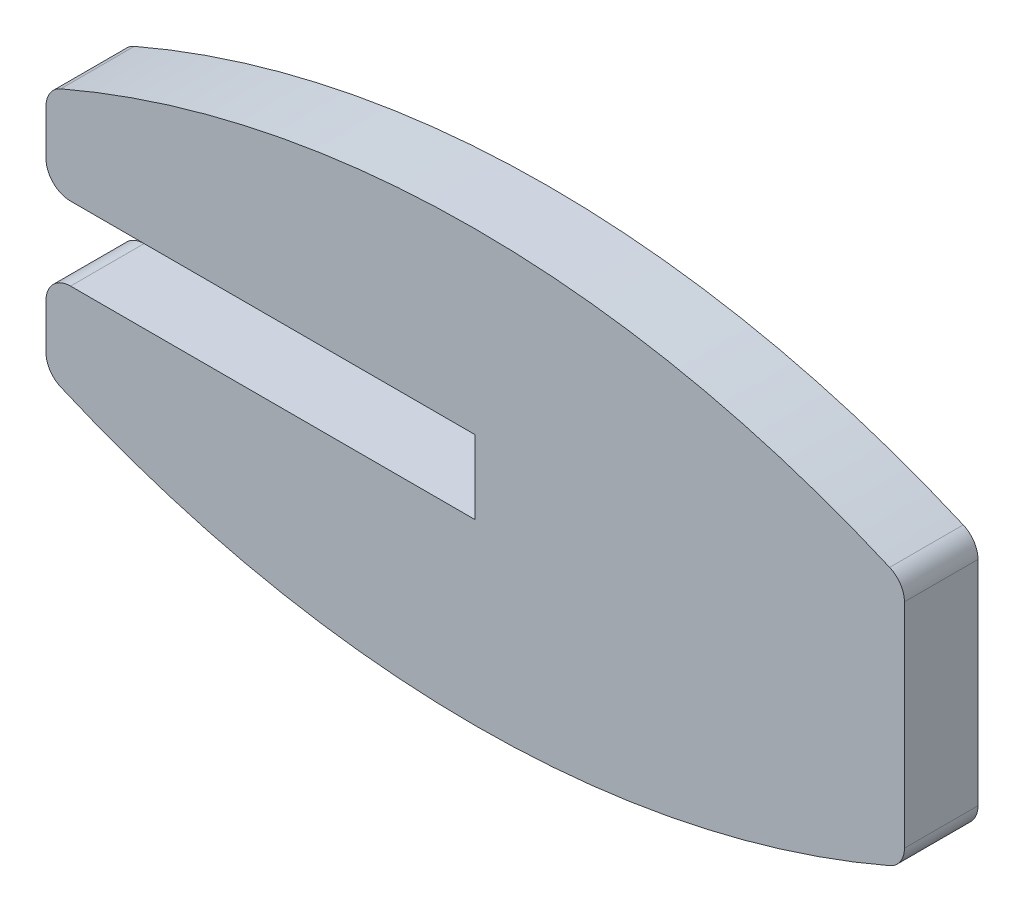
ISO-10303-21;
HEADER;
FILE_DESCRIPTION(('STEP AP214'),'2;1');
FILE_NAME('part.step','',(''),(''),'','','');
FILE_SCHEMA(('AUTOMOTIVE_DESIGN { 1 0 10303 214 1 1 1 1 }'));
ENDSEC;
DATA;
#1=APPLICATION_CONTEXT('core data for automotive mechanical design processes');
#2=APPLICATION_PROTOCOL_DEFINITION('international standard','automotive_design',2000,#1);
#3=PRODUCT_CONTEXT('',#1,'mechanical');
#4=PRODUCT('Part','Part','',(#3));
#5=PRODUCT_RELATED_PRODUCT_CATEGORY('part','',(#4));
#6=PRODUCT_DEFINITION_FORMATION('','',#4);
#7=PRODUCT_DEFINITION_CONTEXT('part definition',#1,'design');
#8=PRODUCT_DEFINITION('design','',#6,#7);
#9=PRODUCT_DEFINITION_SHAPE('','',#8);
#10=(LENGTH_UNIT() NAMED_UNIT(*) SI_UNIT(.MILLI.,.METRE.));
#11=(NAMED_UNIT(*) PLANE_ANGLE_UNIT() SI_UNIT($,.RADIAN.));
#12=(NAMED_UNIT(*) SI_UNIT($,.STERADIAN.) SOLID_ANGLE_UNIT());
#13=UNCERTAINTY_MEASURE_WITH_UNIT(LENGTH_MEASURE(1.E-05),#10,'distance_accuracy_value','');
#14=(GEOMETRIC_REPRESENTATION_CONTEXT(3) GLOBAL_UNCERTAINTY_ASSIGNED_CONTEXT((#13)) GLOBAL_UNIT_ASSIGNED_CONTEXT((#10,
#11,#12)) REPRESENTATION_CONTEXT('',''));
#15=CARTESIAN_POINT('',(0.,0.,0.));
#16=DIRECTION('',(0.,0.,1.));
#17=DIRECTION('',(1.,0.,0.));
#18=AXIS2_PLACEMENT_3D('',#15,#16,#17);
#19=CARTESIAN_POINT('',(0.,0.,3.));
#20=DIRECTION('',(1.,0.,0.));
#21=DIRECTION('',(0.,1.,0.));
#22=AXIS2_PLACEMENT_3D('',#19,#20,#21);
#23=PLANE('',#22);
#24=DIRECTION('',(0.,-1.,0.));
#25=VECTOR('',#24,1.);
#26=CARTESIAN_POINT('',(0.,0.,0.));
#27=LINE('',#26,#25);
#28=CARTESIAN_POINT('',(0.,1.5,0.));
#29=VERTEX_POINT('',#28);
#30=CARTESIAN_POINT('',(0.,-1.5,0.));
#31=VERTEX_POINT('',#30);
#32=EDGE_CURVE('E160',#29,#31,#27,.T.);
#33=ORIENTED_EDGE('',*,*,#32,.T.);
#34=DIRECTION('',(0.,0.,-1.));
#35=VECTOR('',#34,1.);
#36=CARTESIAN_POINT('',(0.,-1.5,3.));
#37=LINE('',#36,#35);
#38=CARTESIAN_POINT('',(0.,-1.5,3.));
#39=VERTEX_POINT('',#38);
#40=EDGE_CURVE('E145',#39,#31,#37,.T.);
#41=ORIENTED_EDGE('',*,*,#40,.F.);
#42=DIRECTION('',(0.,-1.,0.));
#43=VECTOR('',#42,1.);
#44=CARTESIAN_POINT('',(0.,0.,3.));
#45=LINE('',#44,#43);
#46=CARTESIAN_POINT('',(0.,1.5,3.));
#47=VERTEX_POINT('',#46);
#48=EDGE_CURVE('E150',#47,#39,#45,.T.);
#49=ORIENTED_EDGE('',*,*,#48,.F.);
#50=DIRECTION('',(0.,0.,-1.));
#51=VECTOR('',#50,1.);
#52=CARTESIAN_POINT('',(0.,1.5,3.));
#53=LINE('',#52,#51);
#54=EDGE_CURVE('E162',#47,#29,#53,.T.);
#55=ORIENTED_EDGE('',*,*,#54,.T.);
#56=EDGE_LOOP('',(#33,#41,#49,#55));
#57=FACE_BOUND('',#56,.T.);
#58=ADVANCED_FACE('F37',(#57),#23,.F.);
#59=CARTESIAN_POINT('',(0.,-1.5,3.));
#60=DIRECTION('',(0.,-1.,0.));
#61=DIRECTION('',(1.,0.,0.));
#62=AXIS2_PLACEMENT_3D('',#59,#60,#61);
#63=PLANE('',#62);
#64=DIRECTION('',(-1.,0.,0.));
#65=VECTOR('',#64,1.);
#66=CARTESIAN_POINT('',(0.,-1.5,0.));
#67=LINE('',#66,#65);
#68=CARTESIAN_POINT('',(-16.5,-1.5,0.));
#69=VERTEX_POINT('',#68);
#70=EDGE_CURVE('E243',#31,#69,#67,.T.);
#71=ORIENTED_EDGE('',*,*,#70,.T.);
#72=DIRECTION('',(0.,0.,-1.));
#73=VECTOR('',#72,1.);
#74=CARTESIAN_POINT('',(-16.5,-1.5,3.));
#75=LINE('',#74,#73);
#76=CARTESIAN_POINT('',(-16.5,-1.5,3.));
#77=VERTEX_POINT('',#76);
#78=EDGE_CURVE('E45',#69,#77,#75,.F.);
#79=ORIENTED_EDGE('',*,*,#78,.T.);
#80=DIRECTION('',(-1.,0.,0.));
#81=VECTOR('',#80,1.);
#82=CARTESIAN_POINT('',(0.,-1.5,3.));
#83=LINE('',#82,#81);
#84=EDGE_CURVE('E140',#39,#77,#83,.T.);
#85=ORIENTED_EDGE('',*,*,#84,.F.);
#86=ORIENTED_EDGE('',*,*,#40,.T.);
#87=EDGE_LOOP('',(#71,#79,#85,#86));
#88=FACE_BOUND('',#87,.T.);
#89=ADVANCED_FACE('F143',(#88),#63,.F.);
#90=CARTESIAN_POINT('',(-17.5,0.,3.));
#91=DIRECTION('',(-1.,0.,0.));
#92=DIRECTION('',(0.,0.,1.));
#93=AXIS2_PLACEMENT_3D('',#90,#91,#92);
#94=PLANE('',#93);
#95=DIRECTION('',(0.,1.,0.));
#96=VECTOR('',#95,1.);
#97=CARTESIAN_POINT('',(-17.5,0.,0.));
#98=LINE('',#97,#96);
#99=CARTESIAN_POINT('',(-17.5,-4.34903206724537,0.));
#100=VERTEX_POINT('',#99);
#101=CARTESIAN_POINT('',(-17.5,-2.5,0.));
#102=VERTEX_POINT('',#101);
#103=EDGE_CURVE('E220',#100,#102,#98,.T.);
#104=ORIENTED_EDGE('',*,*,#103,.F.);
#105=DIRECTION('',(0.,0.,1.));
#106=VECTOR('',#105,1.);
#107=CARTESIAN_POINT('',(-17.5,-4.34903206724537,3.));
#108=LINE('',#107,#106);
#109=CARTESIAN_POINT('',(-17.5,-4.34903206724537,3.));
#110=VERTEX_POINT('',#109);
#111=EDGE_CURVE('E211',#100,#110,#108,.T.);
#112=ORIENTED_EDGE('',*,*,#111,.T.);
#113=DIRECTION('',(0.,1.,0.));
#114=VECTOR('',#113,1.);
#115=CARTESIAN_POINT('',(-17.5,0.,3.));
#116=LINE('',#115,#114);
#117=CARTESIAN_POINT('',(-17.5,-2.5,3.));
#118=VERTEX_POINT('',#117);
#119=EDGE_CURVE('E149',#110,#118,#116,.T.);
#120=ORIENTED_EDGE('',*,*,#119,.T.);
#121=DIRECTION('',(0.,0.,-1.));
#122=VECTOR('',#121,1.);
#123=CARTESIAN_POINT('',(-17.5,-2.5,0.));
#124=LINE('',#123,#122);
#125=EDGE_CURVE('E208',#118,#102,#124,.T.);
#126=ORIENTED_EDGE('',*,*,#125,.T.);
#127=EDGE_LOOP('',(#104,#112,#120,#126));
#128=FACE_BOUND('',#127,.T.);
#129=ADVANCED_FACE('F217',(#128),#94,.T.);
#130=CARTESIAN_POINT('',(0.,33.7298334620742,3.));
#131=DIRECTION('',(0.,0.,-1.));
#132=DIRECTION('',(-1.,0.,0.));
#133=AXIS2_PLACEMENT_3D('',#130,#131,#132);
#134=CYLINDRICAL_SURFACE('',#133,42.5);
#135=CARTESIAN_POINT('',(0.,33.7298334620742,0.));
#136=DIRECTION('',(0.,0.,1.));
#137=DIRECTION('',(1.,0.,0.));
#138=AXIS2_PLACEMENT_3D('',#135,#136,#137);
#139=CIRCLE('',#138,42.5);
#140=CARTESIAN_POINT('',(-16.8975903614458,-5.26659509204826,0.));
#141=VERTEX_POINT('',#140);
#142=CARTESIAN_POINT('',(16.8975903614458,-5.26659509204826,0.));
#143=VERTEX_POINT('',#142);
#144=EDGE_CURVE('E233',#141,#143,#139,.T.);
#145=ORIENTED_EDGE('',*,*,#144,.T.);
#146=DIRECTION('',(0.,0.,-1.));
#147=VECTOR('',#146,1.);
#148=CARTESIAN_POINT('',(16.8975903614458,-5.26659509204826,3.));
#149=LINE('',#148,#147);
#150=CARTESIAN_POINT('',(16.8975903614458,-5.26659509204826,3.));
#151=VERTEX_POINT('',#150);
#152=EDGE_CURVE('E186',#143,#151,#149,.F.);
#153=ORIENTED_EDGE('',*,*,#152,.T.);
#154=CARTESIAN_POINT('',(0.,33.7298334620742,3.));
#155=DIRECTION('',(0.,0.,1.));
#156=DIRECTION('',(1.,0.,0.));
#157=AXIS2_PLACEMENT_3D('',#154,#155,#156);
#158=CIRCLE('',#157,42.5);
#159=CARTESIAN_POINT('',(-16.8975903614458,-5.26659509204826,3.));
#160=VERTEX_POINT('',#159);
#161=EDGE_CURVE('E224',#160,#151,#158,.T.);
#162=ORIENTED_EDGE('',*,*,#161,.F.);
#163=DIRECTION('',(0.,0.,-1.));
#164=VECTOR('',#163,1.);
#165=CARTESIAN_POINT('',(-16.8975903614458,-5.26659509204826,3.));
#166=LINE('',#165,#164);
#167=EDGE_CURVE('E183',#160,#141,#166,.T.);
#168=ORIENTED_EDGE('',*,*,#167,.T.);
#169=EDGE_LOOP('',(#145,#153,#162,#168));
#170=FACE_BOUND('',#169,.T.);
#171=ADVANCED_FACE('F232',(#170),#134,.T.);
#172=CARTESIAN_POINT('',(17.5,0.,3.));
#173=DIRECTION('',(-1.,0.,0.));
#174=DIRECTION('',(0.,0.,1.));
#175=AXIS2_PLACEMENT_3D('',#172,#173,#174);
#176=PLANE('',#175);
#177=DIRECTION('',(0.,1.,0.));
#178=VECTOR('',#177,1.);
#179=CARTESIAN_POINT('',(17.5,0.,3.));
#180=LINE('',#179,#178);
#181=CARTESIAN_POINT('',(17.5,-4.34903206724537,3.));
#182=VERTEX_POINT('',#181);
#183=CARTESIAN_POINT('',(17.5,4.34903206724537,3.));
#184=VERTEX_POINT('',#183);
#185=EDGE_CURVE('E303',#182,#184,#180,.T.);
#186=ORIENTED_EDGE('',*,*,#185,.F.);
#187=DIRECTION('',(0.,0.,-1.));
#188=VECTOR('',#187,1.);
#189=CARTESIAN_POINT('',(17.5,-4.34903206724537,3.));
#190=LINE('',#189,#188);
#191=CARTESIAN_POINT('',(17.5,-4.34903206724537,0.));
#192=VERTEX_POINT('',#191);
#193=EDGE_CURVE('E164',#182,#192,#190,.T.);
#194=ORIENTED_EDGE('',*,*,#193,.T.);
#195=DIRECTION('',(0.,1.,0.));
#196=VECTOR('',#195,1.);
#197=CARTESIAN_POINT('',(17.5,0.,0.));
#198=LINE('',#197,#196);
#199=CARTESIAN_POINT('',(17.5,4.34903206724537,0.));
#200=VERTEX_POINT('',#199);
#201=EDGE_CURVE('E238',#192,#200,#198,.T.);
#202=ORIENTED_EDGE('',*,*,#201,.T.);
#203=DIRECTION('',(0.,0.,1.));
#204=VECTOR('',#203,1.);
#205=CARTESIAN_POINT('',(17.5,4.34903206724537,3.));
#206=LINE('',#205,#204);
#207=EDGE_CURVE('E161',#200,#184,#206,.T.);
#208=ORIENTED_EDGE('',*,*,#207,.T.);
#209=EDGE_LOOP('',(#186,#194,#202,#208));
#210=FACE_BOUND('',#209,.T.);
#211=ADVANCED_FACE('F309',(#210),#176,.F.);
#212=CARTESIAN_POINT('',(0.,-33.7298334620742,3.));
#213=DIRECTION('',(0.,0.,-1.));
#214=DIRECTION('',(-1.,0.,0.));
#215=AXIS2_PLACEMENT_3D('',#212,#213,#214);
#216=CYLINDRICAL_SURFACE('',#215,42.5);
#217=CARTESIAN_POINT('',(0.,-33.7298334620742,3.));
#218=DIRECTION('',(0.,0.,1.));
#219=DIRECTION('',(1.,0.,0.));
#220=AXIS2_PLACEMENT_3D('',#217,#218,#219);
#221=CIRCLE('',#220,42.5);
#222=CARTESIAN_POINT('',(-16.8975903614458,5.26659509204825,3.));
#223=VERTEX_POINT('',#222);
#224=CARTESIAN_POINT('',(16.8975903614458,5.26659509204825,3.));
#225=VERTEX_POINT('',#224);
#226=EDGE_CURVE('E263',#223,#225,#221,.F.);
#227=ORIENTED_EDGE('',*,*,#226,.T.);
#228=DIRECTION('',(0.,0.,-1.));
#229=VECTOR('',#228,1.);
#230=CARTESIAN_POINT('',(16.8975903614458,5.26659509204825,3.));
#231=LINE('',#230,#229);
#232=CARTESIAN_POINT('',(16.8975903614458,5.26659509204825,0.));
#233=VERTEX_POINT('',#232);
#234=EDGE_CURVE('E200',#225,#233,#231,.T.);
#235=ORIENTED_EDGE('',*,*,#234,.T.);
#236=CARTESIAN_POINT('',(0.,-33.7298334620742,0.));
#237=DIRECTION('',(0.,0.,1.));
#238=DIRECTION('',(1.,0.,0.));
#239=AXIS2_PLACEMENT_3D('',#236,#237,#238);
#240=CIRCLE('',#239,42.5);
#241=CARTESIAN_POINT('',(-16.8975903614458,5.26659509204825,0.));
#242=VERTEX_POINT('',#241);
#243=EDGE_CURVE('E241',#242,#233,#240,.F.);
#244=ORIENTED_EDGE('',*,*,#243,.F.);
#245=DIRECTION('',(0.,0.,-1.));
#246=VECTOR('',#245,1.);
#247=CARTESIAN_POINT('',(-16.8975903614458,5.26659509204825,3.));
#248=LINE('',#247,#246);
#249=EDGE_CURVE('E198',#242,#223,#248,.F.);
#250=ORIENTED_EDGE('',*,*,#249,.T.);
#251=EDGE_LOOP('',(#227,#235,#244,#250));
#252=FACE_BOUND('',#251,.T.);
#253=ADVANCED_FACE('F299',(#252),#216,.T.);
#254=CARTESIAN_POINT('',(-17.5,2.49999999999999,3.));
#255=VERTEX_POINT('',#254);
#256=CARTESIAN_POINT('',(-17.5,4.34903206724537,3.));
#257=VERTEX_POINT('',#256);
#258=EDGE_CURVE('E226',#255,#257,#116,.T.);
#259=ORIENTED_EDGE('',*,*,#258,.T.);
#260=DIRECTION('',(0.,0.,-1.));
#261=VECTOR('',#260,1.);
#262=CARTESIAN_POINT('',(-17.5,4.34903206724537,3.));
#263=LINE('',#262,#261);
#264=CARTESIAN_POINT('',(-17.5,4.34903206724537,0.));
#265=VERTEX_POINT('',#264);
#266=EDGE_CURVE('E205',#257,#265,#263,.T.);
#267=ORIENTED_EDGE('',*,*,#266,.T.);
#268=CARTESIAN_POINT('',(-17.5,2.49999999999999,0.));
#269=VERTEX_POINT('',#268);
#270=EDGE_CURVE('E245',#269,#265,#98,.T.);
#271=ORIENTED_EDGE('',*,*,#270,.F.);
#272=DIRECTION('',(0.,0.,-1.));
#273=VECTOR('',#272,1.);
#274=CARTESIAN_POINT('',(-17.5,2.49999999999999,3.));
#275=LINE('',#274,#273);
#276=EDGE_CURVE('E203',#269,#255,#275,.F.);
#277=ORIENTED_EDGE('',*,*,#276,.T.);
#278=EDGE_LOOP('',(#259,#267,#271,#277));
#279=FACE_BOUND('',#278,.T.);
#280=ADVANCED_FACE('F256',(#279),#94,.T.);
#281=CARTESIAN_POINT('',(0.,1.5,3.));
#282=DIRECTION('',(0.,-1.,0.));
#283=DIRECTION('',(1.,0.,0.));
#284=AXIS2_PLACEMENT_3D('',#281,#282,#283);
#285=PLANE('',#284);
#286=DIRECTION('',(-1.,0.,0.));
#287=VECTOR('',#286,1.);
#288=CARTESIAN_POINT('',(0.,1.5,3.));
#289=LINE('',#288,#287);
#290=CARTESIAN_POINT('',(-16.5,1.49999999999999,3.));
#291=VERTEX_POINT('',#290);
#292=EDGE_CURVE('E155',#47,#291,#289,.T.);
#293=ORIENTED_EDGE('',*,*,#292,.T.);
#294=DIRECTION('',(0.,0.,-1.));
#295=VECTOR('',#294,1.);
#296=CARTESIAN_POINT('',(-16.5,1.49999999999999,3.));
#297=LINE('',#296,#295);
#298=CARTESIAN_POINT('',(-16.5,1.49999999999999,0.));
#299=VERTEX_POINT('',#298);
#300=EDGE_CURVE('E11',#291,#299,#297,.T.);
#301=ORIENTED_EDGE('',*,*,#300,.T.);
#302=DIRECTION('',(-1.,0.,0.));
#303=VECTOR('',#302,1.);
#304=CARTESIAN_POINT('',(0.,1.5,0.));
#305=LINE('',#304,#303);
#306=EDGE_CURVE('E157',#29,#299,#305,.T.);
#307=ORIENTED_EDGE('',*,*,#306,.F.);
#308=ORIENTED_EDGE('',*,*,#54,.F.);
#309=EDGE_LOOP('',(#293,#301,#307,#308));
#310=FACE_BOUND('',#309,.T.);
#311=ADVANCED_FACE('F261',(#310),#285,.T.);
#312=CARTESIAN_POINT('',(0.,0.,3.));
#313=DIRECTION('',(0.,0.,1.));
#314=DIRECTION('',(1.,0.,0.));
#315=AXIS2_PLACEMENT_3D('',#312,#313,#314);
#316=PLANE('',#315);
#317=ORIENTED_EDGE('',*,*,#161,.T.);
#318=CARTESIAN_POINT('',(16.5,-4.34903206724537,3.));
#319=DIRECTION('',(0.,0.,1.));
#320=DIRECTION('',(1.,0.,0.));
#321=AXIS2_PLACEMENT_3D('',#318,#319,#320);
#322=CIRCLE('',#321,1.);
#323=EDGE_CURVE('E196',#151,#182,#322,.T.);
#324=ORIENTED_EDGE('',*,*,#323,.T.);
#325=ORIENTED_EDGE('',*,*,#185,.T.);
#326=CARTESIAN_POINT('',(16.5,4.34903206724537,3.));
#327=DIRECTION('',(0.,0.,1.));
#328=DIRECTION('',(1.,0.,0.));
#329=AXIS2_PLACEMENT_3D('',#326,#327,#328);
#330=CIRCLE('',#329,1.);
#331=EDGE_CURVE('E194',#184,#225,#330,.T.);
#332=ORIENTED_EDGE('',*,*,#331,.T.);
#333=ORIENTED_EDGE('',*,*,#226,.F.);
#334=CARTESIAN_POINT('',(-16.5,4.34903206724537,3.));
#335=DIRECTION('',(0.,0.,1.));
#336=DIRECTION('',(1.,0.,0.));
#337=AXIS2_PLACEMENT_3D('',#334,#335,#336);
#338=CIRCLE('',#337,1.);
#339=EDGE_CURVE('E58',#223,#257,#338,.T.);
#340=ORIENTED_EDGE('',*,*,#339,.T.);
#341=ORIENTED_EDGE('',*,*,#258,.F.);
#342=CARTESIAN_POINT('',(-16.5,2.49999999999999,3.));
#343=DIRECTION('',(0.,0.,1.));
#344=DIRECTION('',(1.,0.,0.));
#345=AXIS2_PLACEMENT_3D('',#342,#343,#344);
#346=CIRCLE('',#345,1.);
#347=EDGE_CURVE('E52',#255,#291,#346,.T.);
#348=ORIENTED_EDGE('',*,*,#347,.T.);
#349=ORIENTED_EDGE('',*,*,#292,.F.);
#350=ORIENTED_EDGE('',*,*,#48,.T.);
#351=ORIENTED_EDGE('',*,*,#84,.T.);
#352=CARTESIAN_POINT('',(-16.5,-2.5,3.));
#353=DIRECTION('',(0.,0.,1.));
#354=DIRECTION('',(1.,0.,0.));
#355=AXIS2_PLACEMENT_3D('',#352,#353,#354);
#356=CIRCLE('',#355,1.);
#357=EDGE_CURVE('E189',#77,#118,#356,.T.);
#358=ORIENTED_EDGE('',*,*,#357,.T.);
#359=ORIENTED_EDGE('',*,*,#119,.F.);
#360=CARTESIAN_POINT('',(-16.5,-4.34903206724537,3.));
#361=DIRECTION('',(0.,0.,1.));
#362=DIRECTION('',(1.,0.,0.));
#363=AXIS2_PLACEMENT_3D('',#360,#361,#362);
#364=CIRCLE('',#363,1.);
#365=EDGE_CURVE('E191',#110,#160,#364,.T.);
#366=ORIENTED_EDGE('',*,*,#365,.T.);
#367=EDGE_LOOP('',(#317,#324,#325,#332,#333,#340,#341,#348,#349,#350,#351,#358,#359,#366));
#368=FACE_BOUND('',#367,.T.);
#369=ADVANCED_FACE('F154',(#368),#316,.T.);
#370=CARTESIAN_POINT('',(0.,0.,0.));
#371=DIRECTION('',(0.,0.,1.));
#372=DIRECTION('',(1.,0.,0.));
#373=AXIS2_PLACEMENT_3D('',#370,#371,#372);
#374=PLANE('',#373);
#375=ORIENTED_EDGE('',*,*,#201,.F.);
#376=CARTESIAN_POINT('',(16.5,-4.34903206724537,0.));
#377=DIRECTION('',(0.,0.,1.));
#378=DIRECTION('',(1.,0.,0.));
#379=AXIS2_PLACEMENT_3D('',#376,#377,#378);
#380=CIRCLE('',#379,1.);
#381=EDGE_CURVE('E181',#192,#143,#380,.F.);
#382=ORIENTED_EDGE('',*,*,#381,.T.);
#383=ORIENTED_EDGE('',*,*,#144,.F.);
#384=CARTESIAN_POINT('',(-16.5,-4.34903206724537,0.));
#385=DIRECTION('',(0.,0.,1.));
#386=DIRECTION('',(1.,0.,0.));
#387=AXIS2_PLACEMENT_3D('',#384,#385,#386);
#388=CIRCLE('',#387,1.);
#389=EDGE_CURVE('E175',#141,#100,#388,.F.);
#390=ORIENTED_EDGE('',*,*,#389,.T.);
#391=ORIENTED_EDGE('',*,*,#103,.T.);
#392=CARTESIAN_POINT('',(-16.5,-2.5,0.));
#393=DIRECTION('',(0.,0.,1.));
#394=DIRECTION('',(1.,0.,0.));
#395=AXIS2_PLACEMENT_3D('',#392,#393,#394);
#396=CIRCLE('',#395,1.);
#397=EDGE_CURVE('E173',#102,#69,#396,.F.);
#398=ORIENTED_EDGE('',*,*,#397,.T.);
#399=ORIENTED_EDGE('',*,*,#70,.F.);
#400=ORIENTED_EDGE('',*,*,#32,.F.);
#401=ORIENTED_EDGE('',*,*,#306,.T.);
#402=CARTESIAN_POINT('',(-16.5,2.49999999999999,0.));
#403=DIRECTION('',(0.,0.,1.));
#404=DIRECTION('',(1.,0.,0.));
#405=AXIS2_PLACEMENT_3D('',#402,#403,#404);
#406=CIRCLE('',#405,1.);
#407=EDGE_CURVE('E171',#299,#269,#406,.F.);
#408=ORIENTED_EDGE('',*,*,#407,.T.);
#409=ORIENTED_EDGE('',*,*,#270,.T.);
#410=CARTESIAN_POINT('',(-16.5,4.34903206724537,0.));
#411=DIRECTION('',(0.,0.,1.));
#412=DIRECTION('',(1.,0.,0.));
#413=AXIS2_PLACEMENT_3D('',#410,#411,#412);
#414=CIRCLE('',#413,1.);
#415=EDGE_CURVE('E177',#265,#242,#414,.F.);
#416=ORIENTED_EDGE('',*,*,#415,.T.);
#417=ORIENTED_EDGE('',*,*,#243,.T.);
#418=CARTESIAN_POINT('',(16.5,4.34903206724537,0.));
#419=DIRECTION('',(0.,0.,1.));
#420=DIRECTION('',(1.,0.,0.));
#421=AXIS2_PLACEMENT_3D('',#418,#419,#420);
#422=CIRCLE('',#421,1.);
#423=EDGE_CURVE('E179',#233,#200,#422,.F.);
#424=ORIENTED_EDGE('',*,*,#423,.T.);
#425=EDGE_LOOP('',(#375,#382,#383,#390,#391,#398,#399,#400,#401,#408,#409,#416,#417,#424));
#426=FACE_BOUND('',#425,.T.);
#427=ADVANCED_FACE('F237',(#426),#374,.F.);
#428=CARTESIAN_POINT('',(16.5,-4.34903206724537,3.));
#429=DIRECTION('',(0.,0.,-1.));
#430=DIRECTION('',(-1.,0.,0.));
#431=AXIS2_PLACEMENT_3D('',#428,#429,#430);
#432=CYLINDRICAL_SURFACE('',#431,1.);
#433=ORIENTED_EDGE('',*,*,#323,.F.);
#434=ORIENTED_EDGE('',*,*,#152,.F.);
#435=ORIENTED_EDGE('',*,*,#381,.F.);
#436=ORIENTED_EDGE('',*,*,#193,.F.);
#437=EDGE_LOOP('',(#433,#434,#435,#436));
#438=FACE_BOUND('',#437,.T.);
#439=ADVANCED_FACE('F284',(#438),#432,.T.);
#440=CARTESIAN_POINT('',(16.5,4.34903206724537,3.));
#441=DIRECTION('',(0.,0.,-1.));
#442=DIRECTION('',(-1.,0.,0.));
#443=AXIS2_PLACEMENT_3D('',#440,#441,#442);
#444=CYLINDRICAL_SURFACE('',#443,1.);
#445=ORIENTED_EDGE('',*,*,#331,.F.);
#446=ORIENTED_EDGE('',*,*,#207,.F.);
#447=ORIENTED_EDGE('',*,*,#423,.F.);
#448=ORIENTED_EDGE('',*,*,#234,.F.);
#449=EDGE_LOOP('',(#445,#446,#447,#448));
#450=FACE_BOUND('',#449,.T.);
#451=ADVANCED_FACE('F287',(#450),#444,.T.);
#452=CARTESIAN_POINT('',(-16.5,4.34903206724537,3.));
#453=DIRECTION('',(0.,0.,-1.));
#454=DIRECTION('',(-1.,0.,0.));
#455=AXIS2_PLACEMENT_3D('',#452,#453,#454);
#456=CYLINDRICAL_SURFACE('',#455,1.);
#457=ORIENTED_EDGE('',*,*,#339,.F.);
#458=ORIENTED_EDGE('',*,*,#249,.F.);
#459=ORIENTED_EDGE('',*,*,#415,.F.);
#460=ORIENTED_EDGE('',*,*,#266,.F.);
#461=EDGE_LOOP('',(#457,#458,#459,#460));
#462=FACE_BOUND('',#461,.T.);
#463=ADVANCED_FACE('F274',(#462),#456,.T.);
#464=CARTESIAN_POINT('',(-16.5,-4.34903206724537,3.));
#465=DIRECTION('',(0.,0.,-1.));
#466=DIRECTION('',(-1.,0.,0.));
#467=AXIS2_PLACEMENT_3D('',#464,#465,#466);
#468=CYLINDRICAL_SURFACE('',#467,1.);
#469=ORIENTED_EDGE('',*,*,#365,.F.);
#470=ORIENTED_EDGE('',*,*,#111,.F.);
#471=ORIENTED_EDGE('',*,*,#389,.F.);
#472=ORIENTED_EDGE('',*,*,#167,.F.);
#473=EDGE_LOOP('',(#469,#470,#471,#472));
#474=FACE_BOUND('',#473,.T.);
#475=ADVANCED_FACE('F228',(#474),#468,.T.);
#476=CARTESIAN_POINT('',(-16.5,-2.5,3.));
#477=DIRECTION('',(0.,0.,1.));
#478=DIRECTION('',(1.,0.,0.));
#479=AXIS2_PLACEMENT_3D('',#476,#477,#478);
#480=CYLINDRICAL_SURFACE('',#479,1.);
#481=ORIENTED_EDGE('',*,*,#357,.F.);
#482=ORIENTED_EDGE('',*,*,#78,.F.);
#483=ORIENTED_EDGE('',*,*,#397,.F.);
#484=ORIENTED_EDGE('',*,*,#125,.F.);
#485=EDGE_LOOP('',(#481,#482,#483,#484));
#486=FACE_BOUND('',#485,.T.);
#487=ADVANCED_FACE('F268',(#486),#480,.T.);
#488=CARTESIAN_POINT('',(-16.5,2.49999999999999,3.));
#489=DIRECTION('',(0.,0.,-1.));
#490=DIRECTION('',(-1.,0.,0.));
#491=AXIS2_PLACEMENT_3D('',#488,#489,#490);
#492=CYLINDRICAL_SURFACE('',#491,1.);
#493=ORIENTED_EDGE('',*,*,#347,.F.);
#494=ORIENTED_EDGE('',*,*,#276,.F.);
#495=ORIENTED_EDGE('',*,*,#407,.F.);
#496=ORIENTED_EDGE('',*,*,#300,.F.);
#497=EDGE_LOOP('',(#493,#494,#495,#496));
#498=FACE_BOUND('',#497,.T.);
#499=ADVANCED_FACE('F39',(#498),#492,.T.);
#500=CLOSED_SHELL('',(#58,#89,#129,#171,#211,#253,#280,#311,#369,#427,#439,#451,#463,#475,#487,#499));
#501=MANIFOLD_SOLID_BREP('B2',#500);
#502=ADVANCED_BREP_SHAPE_REPRESENTATION('',(#18,#501),#14);
#503=SHAPE_DEFINITION_REPRESENTATION(#9,#502);
ENDSEC;
END-ISO-10303-21;
